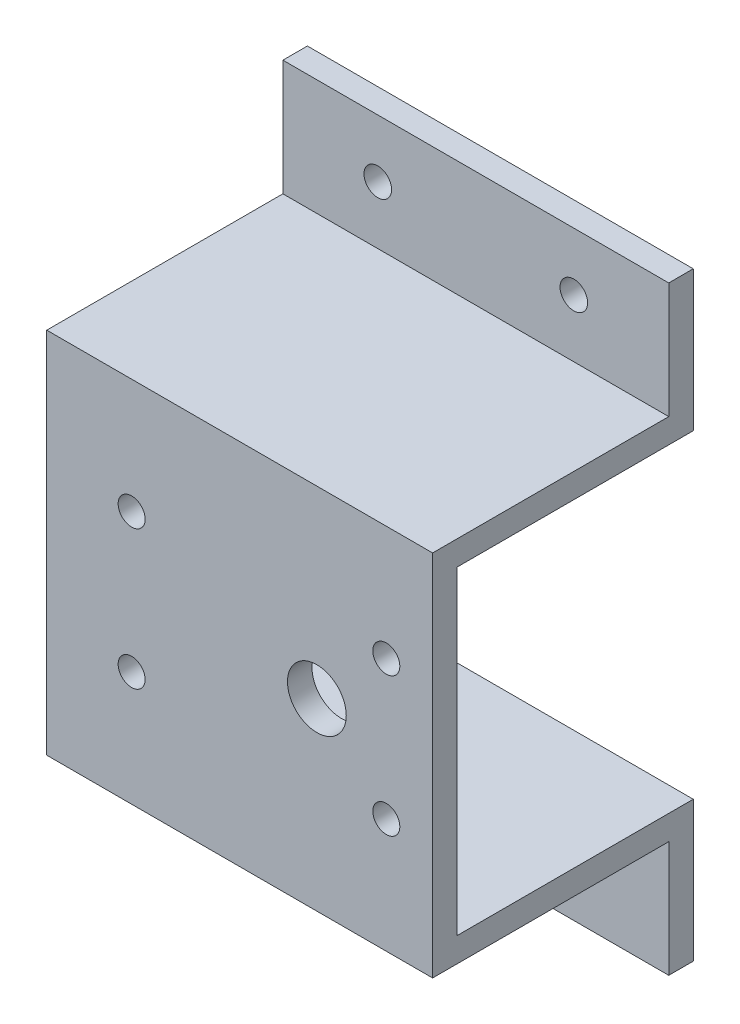
ISO-10303-21;
HEADER;
FILE_DESCRIPTION(('STEP AP214'),'2;1');
FILE_NAME('part.step','',(''),(''),'','','');
FILE_SCHEMA(('AUTOMOTIVE_DESIGN { 1 0 10303 214 1 1 1 1 }'));
ENDSEC;
DATA;
#1=APPLICATION_CONTEXT('core data for automotive mechanical design processes');
#2=APPLICATION_PROTOCOL_DEFINITION('international standard','automotive_design',2000,#1);
#3=PRODUCT_CONTEXT('',#1,'mechanical');
#4=PRODUCT('Part','Part','',(#3));
#5=PRODUCT_RELATED_PRODUCT_CATEGORY('part','',(#4));
#6=PRODUCT_DEFINITION_FORMATION('','',#4);
#7=PRODUCT_DEFINITION_CONTEXT('part definition',#1,'design');
#8=PRODUCT_DEFINITION('design','',#6,#7);
#9=PRODUCT_DEFINITION_SHAPE('','',#8);
#10=(LENGTH_UNIT() NAMED_UNIT(*) SI_UNIT(.MILLI.,.METRE.));
#11=(NAMED_UNIT(*) PLANE_ANGLE_UNIT() SI_UNIT($,.RADIAN.));
#12=(NAMED_UNIT(*) SI_UNIT($,.STERADIAN.) SOLID_ANGLE_UNIT());
#13=UNCERTAINTY_MEASURE_WITH_UNIT(LENGTH_MEASURE(1.E-05),#10,'distance_accuracy_value','');
#14=(GEOMETRIC_REPRESENTATION_CONTEXT(3) GLOBAL_UNCERTAINTY_ASSIGNED_CONTEXT((#13)) GLOBAL_UNIT_ASSIGNED_CONTEXT((#10,
#11,#12)) REPRESENTATION_CONTEXT('',''));
#15=CARTESIAN_POINT('',(0.,0.,0.));
#16=DIRECTION('',(0.,0.,1.));
#17=DIRECTION('',(1.,0.,0.));
#18=AXIS2_PLACEMENT_3D('',#15,#16,#17);
#19=CARTESIAN_POINT('',(0.,-23.85,3.175));
#20=DIRECTION('',(0.,-1.,0.));
#21=DIRECTION('',(1.,0.,0.));
#22=AXIS2_PLACEMENT_3D('',#19,#20,#21);
#23=PLANE('',#22);
#24=DIRECTION('',(0.,0.,-1.));
#25=VECTOR('',#24,1.);
#26=CARTESIAN_POINT('',(-35.,-23.85,3.175));
#27=LINE('',#26,#25);
#28=CARTESIAN_POINT('',(-35.,-23.85,3.175));
#29=VERTEX_POINT('',#28);
#30=CARTESIAN_POINT('',(-35.,-23.85,-27.4226));
#31=VERTEX_POINT('',#30);
#32=EDGE_CURVE('E283',#29,#31,#27,.T.);
#33=ORIENTED_EDGE('',*,*,#32,.T.);
#34=DIRECTION('',(1.,0.,0.));
#35=VECTOR('',#34,1.);
#36=CARTESIAN_POINT('',(-35.,-23.85,-27.4226));
#37=LINE('',#36,#35);
#38=CARTESIAN_POINT('',(15.,-23.85,-27.4226));
#39=VERTEX_POINT('',#38);
#40=EDGE_CURVE('E151',#31,#39,#37,.T.);
#41=ORIENTED_EDGE('',*,*,#40,.T.);
#42=DIRECTION('',(0.,0.,-1.));
#43=VECTOR('',#42,1.);
#44=CARTESIAN_POINT('',(15.,-23.85,3.175));
#45=LINE('',#44,#43);
#46=CARTESIAN_POINT('',(15.,-23.85,3.175));
#47=VERTEX_POINT('',#46);
#48=EDGE_CURVE('E11',#47,#39,#45,.T.);
#49=ORIENTED_EDGE('',*,*,#48,.F.);
#50=DIRECTION('',(-1.,0.,0.));
#51=VECTOR('',#50,1.);
#52=CARTESIAN_POINT('',(0.,-23.85,3.175));
#53=LINE('',#52,#51);
#54=EDGE_CURVE('E248',#47,#29,#53,.T.);
#55=ORIENTED_EDGE('',*,*,#54,.T.);
#56=EDGE_LOOP('',(#33,#41,#49,#55));
#57=FACE_BOUND('',#56,.T.);
#58=ADVANCED_FACE('F38',(#57),#23,.T.);
#59=CARTESIAN_POINT('',(0.,23.85,3.175));
#60=DIRECTION('',(0.,-1.,0.));
#61=DIRECTION('',(1.,0.,0.));
#62=AXIS2_PLACEMENT_3D('',#59,#60,#61);
#63=PLANE('',#62);
#64=DIRECTION('',(1.,0.,0.));
#65=VECTOR('',#64,1.);
#66=CARTESIAN_POINT('',(-35.,23.85,-27.4226));
#67=LINE('',#66,#65);
#68=CARTESIAN_POINT('',(-35.,23.85,-27.4226));
#69=VERTEX_POINT('',#68);
#70=CARTESIAN_POINT('',(15.,23.85,-27.4226));
#71=VERTEX_POINT('',#70);
#72=EDGE_CURVE('E61',#69,#71,#67,.T.);
#73=ORIENTED_EDGE('',*,*,#72,.F.);
#74=DIRECTION('',(0.,0.,-1.));
#75=VECTOR('',#74,1.);
#76=CARTESIAN_POINT('',(-35.,23.85,3.175));
#77=LINE('',#76,#75);
#78=CARTESIAN_POINT('',(-35.,23.85,3.175));
#79=VERTEX_POINT('',#78);
#80=EDGE_CURVE('E311',#79,#69,#77,.T.);
#81=ORIENTED_EDGE('',*,*,#80,.F.);
#82=DIRECTION('',(-1.,0.,0.));
#83=VECTOR('',#82,1.);
#84=CARTESIAN_POINT('',(0.,23.85,3.175));
#85=LINE('',#84,#83);
#86=CARTESIAN_POINT('',(15.,23.85,3.175));
#87=VERTEX_POINT('',#86);
#88=EDGE_CURVE('E257',#87,#79,#85,.T.);
#89=ORIENTED_EDGE('',*,*,#88,.F.);
#90=DIRECTION('',(0.,0.,-1.));
#91=VECTOR('',#90,1.);
#92=CARTESIAN_POINT('',(15.,23.85,3.175));
#93=LINE('',#92,#91);
#94=EDGE_CURVE('E46',#87,#71,#93,.T.);
#95=ORIENTED_EDGE('',*,*,#94,.T.);
#96=EDGE_LOOP('',(#73,#81,#89,#95));
#97=FACE_BOUND('',#96,.T.);
#98=ADVANCED_FACE('F315',(#97),#63,.F.);
#99=CARTESIAN_POINT('',(0.,0.,0.));
#100=DIRECTION('',(0.,0.,1.));
#101=DIRECTION('',(1.,0.,0.));
#102=AXIS2_PLACEMENT_3D('',#99,#100,#101);
#103=PLANE('',#102);
#104=CARTESIAN_POINT('',(-24.,-9.,0.));
#105=DIRECTION('',(0.,0.,1.));
#106=DIRECTION('',(1.,0.,0.));
#107=AXIS2_PLACEMENT_3D('',#104,#105,#106);
#108=CIRCLE('',#107,1.75);
#109=CARTESIAN_POINT('',(-22.25,-9.,0.));
#110=VERTEX_POINT('',#109);
#111=EDGE_CURVE('E289',#110,#110,#108,.T.);
#112=ORIENTED_EDGE('',*,*,#111,.T.);
#113=EDGE_LOOP('',(#112));
#114=FACE_BOUND('',#113,.T.);
#115=CARTESIAN_POINT('',(9.,9.,0.));
#116=DIRECTION('',(0.,0.,1.));
#117=DIRECTION('',(1.,0.,0.));
#118=AXIS2_PLACEMENT_3D('',#115,#116,#117);
#119=CIRCLE('',#118,1.75);
#120=CARTESIAN_POINT('',(10.75,9.,0.));
#121=VERTEX_POINT('',#120);
#122=EDGE_CURVE('E293',#121,#121,#119,.T.);
#123=ORIENTED_EDGE('',*,*,#122,.T.);
#124=EDGE_LOOP('',(#123));
#125=FACE_BOUND('',#124,.T.);
#126=CARTESIAN_POINT('',(0.,0.,0.));
#127=DIRECTION('',(0.,0.,1.));
#128=DIRECTION('',(1.,0.,0.));
#129=AXIS2_PLACEMENT_3D('',#126,#127,#128);
#130=CIRCLE('',#129,3.81);
#131=CARTESIAN_POINT('',(3.81,0.,0.));
#132=VERTEX_POINT('',#131);
#133=EDGE_CURVE('E297',#132,#132,#130,.T.);
#134=ORIENTED_EDGE('',*,*,#133,.T.);
#135=EDGE_LOOP('',(#134));
#136=FACE_BOUND('',#135,.T.);
#137=CARTESIAN_POINT('',(9.,-9.,0.));
#138=DIRECTION('',(0.,0.,1.));
#139=DIRECTION('',(1.,0.,0.));
#140=AXIS2_PLACEMENT_3D('',#137,#138,#139);
#141=CIRCLE('',#140,1.75);
#142=CARTESIAN_POINT('',(10.75,-9.,0.));
#143=VERTEX_POINT('',#142);
#144=EDGE_CURVE('E301',#143,#143,#141,.T.);
#145=ORIENTED_EDGE('',*,*,#144,.T.);
#146=EDGE_LOOP('',(#145));
#147=FACE_BOUND('',#146,.T.);
#148=CARTESIAN_POINT('',(-24.,9.,0.));
#149=DIRECTION('',(0.,0.,1.));
#150=DIRECTION('',(1.,0.,0.));
#151=AXIS2_PLACEMENT_3D('',#148,#149,#150);
#152=CIRCLE('',#151,1.75);
#153=CARTESIAN_POINT('',(-22.25,9.,0.));
#154=VERTEX_POINT('',#153);
#155=EDGE_CURVE('E253',#154,#154,#152,.T.);
#156=ORIENTED_EDGE('',*,*,#155,.T.);
#157=EDGE_LOOP('',(#156));
#158=FACE_BOUND('',#157,.T.);
#159=DIRECTION('',(-1.,0.,0.));
#160=VECTOR('',#159,1.);
#161=CARTESIAN_POINT('',(15.,20.675,0.));
#162=LINE('',#161,#160);
#163=CARTESIAN_POINT('',(15.,20.675,0.));
#164=VERTEX_POINT('',#163);
#165=CARTESIAN_POINT('',(-35.,20.675,0.));
#166=VERTEX_POINT('',#165);
#167=EDGE_CURVE('E214',#164,#166,#162,.T.);
#168=ORIENTED_EDGE('',*,*,#167,.F.);
#169=DIRECTION('',(0.,-1.,0.));
#170=VECTOR('',#169,1.);
#171=CARTESIAN_POINT('',(15.,0.,0.));
#172=LINE('',#171,#170);
#173=CARTESIAN_POINT('',(15.,-20.675,0.));
#174=VERTEX_POINT('',#173);
#175=EDGE_CURVE('E247',#164,#174,#172,.T.);
#176=ORIENTED_EDGE('',*,*,#175,.T.);
#177=DIRECTION('',(1.,0.,0.));
#178=VECTOR('',#177,1.);
#179=CARTESIAN_POINT('',(-35.,-20.675,0.));
#180=LINE('',#179,#178);
#181=CARTESIAN_POINT('',(-35.,-20.675,0.));
#182=VERTEX_POINT('',#181);
#183=EDGE_CURVE('E141',#182,#174,#180,.T.);
#184=ORIENTED_EDGE('',*,*,#183,.F.);
#185=DIRECTION('',(0.,-1.,0.));
#186=VECTOR('',#185,1.);
#187=CARTESIAN_POINT('',(-35.,0.,0.));
#188=LINE('',#187,#186);
#189=EDGE_CURVE('E286',#166,#182,#188,.T.);
#190=ORIENTED_EDGE('',*,*,#189,.F.);
#191=EDGE_LOOP('',(#168,#176,#184,#190));
#192=FACE_BOUND('',#191,.T.);
#193=ADVANCED_FACE('F361',(#114,#125,#136,#147,#158,#192),#103,.F.);
#194=CARTESIAN_POINT('',(15.,0.,3.175));
#195=DIRECTION('',(1.,0.,0.));
#196=DIRECTION('',(0.,0.,-1.));
#197=AXIS2_PLACEMENT_3D('',#194,#195,#196);
#198=PLANE('',#197);
#199=ORIENTED_EDGE('',*,*,#175,.F.);
#200=DIRECTION('',(0.,0.,1.));
#201=VECTOR('',#200,1.);
#202=CARTESIAN_POINT('',(15.,20.675,-30.5976));
#203=LINE('',#202,#201);
#204=CARTESIAN_POINT('',(15.,20.675,-30.5976));
#205=VERTEX_POINT('',#204);
#206=EDGE_CURVE('E231',#205,#164,#203,.T.);
#207=ORIENTED_EDGE('',*,*,#206,.F.);
#208=DIRECTION('',(0.,-1.,0.));
#209=VECTOR('',#208,1.);
#210=CARTESIAN_POINT('',(15.,23.85,-30.5976));
#211=LINE('',#210,#209);
#212=CARTESIAN_POINT('',(15.,38.85,-30.5976));
#213=VERTEX_POINT('',#212);
#214=EDGE_CURVE('E215',#213,#205,#211,.T.);
#215=ORIENTED_EDGE('',*,*,#214,.F.);
#216=DIRECTION('',(0.,0.,-1.));
#217=VECTOR('',#216,1.);
#218=CARTESIAN_POINT('',(15.,38.85,-30.5976));
#219=LINE('',#218,#217);
#220=CARTESIAN_POINT('',(15.,38.85,-27.4226));
#221=VERTEX_POINT('',#220);
#222=EDGE_CURVE('E196',#221,#213,#219,.T.);
#223=ORIENTED_EDGE('',*,*,#222,.F.);
#224=DIRECTION('',(0.,-1.,0.));
#225=VECTOR('',#224,1.);
#226=CARTESIAN_POINT('',(15.,38.85,-27.4226));
#227=LINE('',#226,#225);
#228=EDGE_CURVE('E204',#221,#71,#227,.T.);
#229=ORIENTED_EDGE('',*,*,#228,.T.);
#230=ORIENTED_EDGE('',*,*,#94,.F.);
#231=DIRECTION('',(0.,-1.,0.));
#232=VECTOR('',#231,1.);
#233=CARTESIAN_POINT('',(15.,0.,3.175));
#234=LINE('',#233,#232);
#235=EDGE_CURVE('E252',#87,#47,#234,.T.);
#236=ORIENTED_EDGE('',*,*,#235,.T.);
#237=ORIENTED_EDGE('',*,*,#48,.T.);
#238=DIRECTION('',(0.,1.,0.));
#239=VECTOR('',#238,1.);
#240=CARTESIAN_POINT('',(15.,-38.85,-27.4226));
#241=LINE('',#240,#239);
#242=CARTESIAN_POINT('',(15.,-38.85,-27.4226));
#243=VERTEX_POINT('',#242);
#244=EDGE_CURVE('E53',#243,#39,#241,.T.);
#245=ORIENTED_EDGE('',*,*,#244,.F.);
#246=DIRECTION('',(0.,0.,-1.));
#247=VECTOR('',#246,1.);
#248=CARTESIAN_POINT('',(15.,-38.85,-30.5976));
#249=LINE('',#248,#247);
#250=CARTESIAN_POINT('',(15.,-38.85,-30.5976));
#251=VERTEX_POINT('',#250);
#252=EDGE_CURVE('E157',#243,#251,#249,.T.);
#253=ORIENTED_EDGE('',*,*,#252,.T.);
#254=DIRECTION('',(0.,-1.,0.));
#255=VECTOR('',#254,1.);
#256=CARTESIAN_POINT('',(15.,-23.85,-30.5976));
#257=LINE('',#256,#255);
#258=CARTESIAN_POINT('',(15.,-20.675,-30.5976));
#259=VERTEX_POINT('',#258);
#260=EDGE_CURVE('E155',#259,#251,#257,.T.);
#261=ORIENTED_EDGE('',*,*,#260,.F.);
#262=DIRECTION('',(0.,0.,1.));
#263=VECTOR('',#262,1.);
#264=CARTESIAN_POINT('',(15.,-20.675,-30.5976));
#265=LINE('',#264,#263);
#266=EDGE_CURVE('E238',#259,#174,#265,.T.);
#267=ORIENTED_EDGE('',*,*,#266,.T.);
#268=EDGE_LOOP('',(#199,#207,#215,#223,#229,#230,#236,#237,#245,#253,#261,#267));
#269=FACE_BOUND('',#268,.T.);
#270=ADVANCED_FACE('F324',(#269),#198,.T.);
#271=CARTESIAN_POINT('',(9.,-9.,3.175));
#272=DIRECTION('',(0.,0.,-1.));
#273=DIRECTION('',(-1.,0.,0.));
#274=AXIS2_PLACEMENT_3D('',#271,#272,#273);
#275=CYLINDRICAL_SURFACE('',#274,1.75);
#276=CARTESIAN_POINT('',(9.,-9.,3.175));
#277=DIRECTION('',(0.,0.,1.));
#278=DIRECTION('',(1.,0.,0.));
#279=AXIS2_PLACEMENT_3D('',#276,#277,#278);
#280=CIRCLE('',#279,1.75);
#281=CARTESIAN_POINT('',(10.75,-9.,3.175));
#282=VERTEX_POINT('',#281);
#283=EDGE_CURVE('E275',#282,#282,#280,.T.);
#284=ORIENTED_EDGE('',*,*,#283,.T.);
#285=EDGE_LOOP('',(#284));
#286=FACE_BOUND('',#285,.T.);
#287=ORIENTED_EDGE('',*,*,#144,.F.);
#288=EDGE_LOOP('',(#287));
#289=FACE_BOUND('',#288,.T.);
#290=ADVANCED_FACE('F371',(#286,#289),#275,.F.);
#291=CARTESIAN_POINT('',(0.,0.,3.175));
#292=DIRECTION('',(0.,0.,-1.));
#293=DIRECTION('',(-1.,0.,0.));
#294=AXIS2_PLACEMENT_3D('',#291,#292,#293);
#295=CYLINDRICAL_SURFACE('',#294,3.81);
#296=CARTESIAN_POINT('',(0.,0.,3.175));
#297=DIRECTION('',(0.,0.,1.));
#298=DIRECTION('',(1.,0.,0.));
#299=AXIS2_PLACEMENT_3D('',#296,#297,#298);
#300=CIRCLE('',#299,3.81);
#301=CARTESIAN_POINT('',(3.81,0.,3.175));
#302=VERTEX_POINT('',#301);
#303=EDGE_CURVE('E271',#302,#302,#300,.T.);
#304=ORIENTED_EDGE('',*,*,#303,.T.);
#305=EDGE_LOOP('',(#304));
#306=FACE_BOUND('',#305,.T.);
#307=ORIENTED_EDGE('',*,*,#133,.F.);
#308=EDGE_LOOP('',(#307));
#309=FACE_BOUND('',#308,.T.);
#310=ADVANCED_FACE('F375',(#306,#309),#295,.F.);
#311=CARTESIAN_POINT('',(9.,9.,3.175));
#312=DIRECTION('',(0.,0.,-1.));
#313=DIRECTION('',(-1.,0.,0.));
#314=AXIS2_PLACEMENT_3D('',#311,#312,#313);
#315=CYLINDRICAL_SURFACE('',#314,1.75);
#316=CARTESIAN_POINT('',(9.,9.,3.175));
#317=DIRECTION('',(0.,0.,1.));
#318=DIRECTION('',(1.,0.,0.));
#319=AXIS2_PLACEMENT_3D('',#316,#317,#318);
#320=CIRCLE('',#319,1.75);
#321=CARTESIAN_POINT('',(10.75,9.,3.175));
#322=VERTEX_POINT('',#321);
#323=EDGE_CURVE('E267',#322,#322,#320,.T.);
#324=ORIENTED_EDGE('',*,*,#323,.T.);
#325=EDGE_LOOP('',(#324));
#326=FACE_BOUND('',#325,.T.);
#327=ORIENTED_EDGE('',*,*,#122,.F.);
#328=EDGE_LOOP('',(#327));
#329=FACE_BOUND('',#328,.T.);
#330=ADVANCED_FACE('F381',(#326,#329),#315,.F.);
#331=CARTESIAN_POINT('',(-24.,-9.,3.175));
#332=DIRECTION('',(0.,0.,-1.));
#333=DIRECTION('',(-1.,0.,0.));
#334=AXIS2_PLACEMENT_3D('',#331,#332,#333);
#335=CYLINDRICAL_SURFACE('',#334,1.75);
#336=CARTESIAN_POINT('',(-24.,-9.,3.175));
#337=DIRECTION('',(0.,0.,1.));
#338=DIRECTION('',(1.,0.,0.));
#339=AXIS2_PLACEMENT_3D('',#336,#337,#338);
#340=CIRCLE('',#339,1.75);
#341=CARTESIAN_POINT('',(-22.25,-9.,3.175));
#342=VERTEX_POINT('',#341);
#343=EDGE_CURVE('E263',#342,#342,#340,.T.);
#344=ORIENTED_EDGE('',*,*,#343,.T.);
#345=EDGE_LOOP('',(#344));
#346=FACE_BOUND('',#345,.T.);
#347=ORIENTED_EDGE('',*,*,#111,.F.);
#348=EDGE_LOOP('',(#347));
#349=FACE_BOUND('',#348,.T.);
#350=ADVANCED_FACE('F389',(#346,#349),#335,.F.);
#351=CARTESIAN_POINT('',(-35.,0.,3.175));
#352=DIRECTION('',(1.,0.,0.));
#353=DIRECTION('',(0.,0.,-1.));
#354=AXIS2_PLACEMENT_3D('',#351,#352,#353);
#355=PLANE('',#354);
#356=ORIENTED_EDGE('',*,*,#80,.T.);
#357=DIRECTION('',(0.,-1.,0.));
#358=VECTOR('',#357,1.);
#359=CARTESIAN_POINT('',(-35.,38.85,-27.4226));
#360=LINE('',#359,#358);
#361=CARTESIAN_POINT('',(-35.,38.85,-27.4226));
#362=VERTEX_POINT('',#361);
#363=EDGE_CURVE('E210',#362,#69,#360,.T.);
#364=ORIENTED_EDGE('',*,*,#363,.F.);
#365=DIRECTION('',(0.,0.,1.));
#366=VECTOR('',#365,1.);
#367=CARTESIAN_POINT('',(-35.,38.85,-30.5976));
#368=LINE('',#367,#366);
#369=CARTESIAN_POINT('',(-35.,38.85,-30.5976));
#370=VERTEX_POINT('',#369);
#371=EDGE_CURVE('E189',#370,#362,#368,.T.);
#372=ORIENTED_EDGE('',*,*,#371,.F.);
#373=DIRECTION('',(0.,1.,0.));
#374=VECTOR('',#373,1.);
#375=CARTESIAN_POINT('',(-35.,23.85,-30.5976));
#376=LINE('',#375,#374);
#377=CARTESIAN_POINT('',(-35.,20.675,-30.5976));
#378=VERTEX_POINT('',#377);
#379=EDGE_CURVE('E222',#378,#370,#376,.T.);
#380=ORIENTED_EDGE('',*,*,#379,.F.);
#381=DIRECTION('',(0.,0.,1.));
#382=VECTOR('',#381,1.);
#383=CARTESIAN_POINT('',(-35.,20.675,-30.5976));
#384=LINE('',#383,#382);
#385=EDGE_CURVE('E225',#378,#166,#384,.T.);
#386=ORIENTED_EDGE('',*,*,#385,.T.);
#387=ORIENTED_EDGE('',*,*,#189,.T.);
#388=DIRECTION('',(0.,0.,1.));
#389=VECTOR('',#388,1.);
#390=CARTESIAN_POINT('',(-35.,-20.675,-30.5976));
#391=LINE('',#390,#389);
#392=CARTESIAN_POINT('',(-35.,-20.675,-30.5976));
#393=VERTEX_POINT('',#392);
#394=EDGE_CURVE('E136',#393,#182,#391,.T.);
#395=ORIENTED_EDGE('',*,*,#394,.F.);
#396=DIRECTION('',(0.,1.,0.));
#397=VECTOR('',#396,1.);
#398=CARTESIAN_POINT('',(-35.,-23.85,-30.5976));
#399=LINE('',#398,#397);
#400=CARTESIAN_POINT('',(-35.,-38.85,-30.5976));
#401=VERTEX_POINT('',#400);
#402=EDGE_CURVE('E130',#401,#393,#399,.T.);
#403=ORIENTED_EDGE('',*,*,#402,.F.);
#404=DIRECTION('',(0.,0.,1.));
#405=VECTOR('',#404,1.);
#406=CARTESIAN_POINT('',(-35.,-38.85,-30.5976));
#407=LINE('',#406,#405);
#408=CARTESIAN_POINT('',(-35.,-38.85,-27.4226));
#409=VERTEX_POINT('',#408);
#410=EDGE_CURVE('E133',#401,#409,#407,.T.);
#411=ORIENTED_EDGE('',*,*,#410,.T.);
#412=DIRECTION('',(0.,1.,0.));
#413=VECTOR('',#412,1.);
#414=CARTESIAN_POINT('',(-35.,-38.85,-27.4226));
#415=LINE('',#414,#413);
#416=EDGE_CURVE('E165',#409,#31,#415,.T.);
#417=ORIENTED_EDGE('',*,*,#416,.T.);
#418=ORIENTED_EDGE('',*,*,#32,.F.);
#419=DIRECTION('',(0.,-1.,0.));
#420=VECTOR('',#419,1.);
#421=CARTESIAN_POINT('',(-35.,0.,3.175));
#422=LINE('',#421,#420);
#423=EDGE_CURVE('E260',#79,#29,#422,.T.);
#424=ORIENTED_EDGE('',*,*,#423,.F.);
#425=EDGE_LOOP('',(#356,#364,#372,#380,#386,#387,#395,#403,#411,#417,#418,#424));
#426=FACE_BOUND('',#425,.T.);
#427=ADVANCED_FACE('F132',(#426),#355,.F.);
#428=CARTESIAN_POINT('',(-24.,9.,3.175));
#429=DIRECTION('',(0.,0.,-1.));
#430=DIRECTION('',(-1.,0.,0.));
#431=AXIS2_PLACEMENT_3D('',#428,#429,#430);
#432=CYLINDRICAL_SURFACE('',#431,1.75);
#433=CARTESIAN_POINT('',(-24.,9.,3.175));
#434=DIRECTION('',(0.,0.,1.));
#435=DIRECTION('',(1.,0.,0.));
#436=AXIS2_PLACEMENT_3D('',#433,#434,#435);
#437=CIRCLE('',#436,1.75);
#438=CARTESIAN_POINT('',(-22.25,9.,3.175));
#439=VERTEX_POINT('',#438);
#440=EDGE_CURVE('E279',#439,#439,#437,.T.);
#441=ORIENTED_EDGE('',*,*,#440,.T.);
#442=EDGE_LOOP('',(#441));
#443=FACE_BOUND('',#442,.T.);
#444=ORIENTED_EDGE('',*,*,#155,.F.);
#445=EDGE_LOOP('',(#444));
#446=FACE_BOUND('',#445,.T.);
#447=ADVANCED_FACE('F386',(#443,#446),#432,.F.);
#448=CARTESIAN_POINT('',(0.,0.,3.175));
#449=DIRECTION('',(0.,0.,1.));
#450=DIRECTION('',(1.,0.,0.));
#451=AXIS2_PLACEMENT_3D('',#448,#449,#450);
#452=PLANE('',#451);
#453=ORIENTED_EDGE('',*,*,#54,.F.);
#454=ORIENTED_EDGE('',*,*,#235,.F.);
#455=ORIENTED_EDGE('',*,*,#88,.T.);
#456=ORIENTED_EDGE('',*,*,#423,.T.);
#457=EDGE_LOOP('',(#453,#454,#455,#456));
#458=FACE_BOUND('',#457,.T.);
#459=ORIENTED_EDGE('',*,*,#343,.F.);
#460=EDGE_LOOP('',(#459));
#461=FACE_BOUND('',#460,.T.);
#462=ORIENTED_EDGE('',*,*,#323,.F.);
#463=EDGE_LOOP('',(#462));
#464=FACE_BOUND('',#463,.T.);
#465=ORIENTED_EDGE('',*,*,#303,.F.);
#466=EDGE_LOOP('',(#465));
#467=FACE_BOUND('',#466,.T.);
#468=ORIENTED_EDGE('',*,*,#283,.F.);
#469=EDGE_LOOP('',(#468));
#470=FACE_BOUND('',#469,.T.);
#471=ORIENTED_EDGE('',*,*,#440,.F.);
#472=EDGE_LOOP('',(#471));
#473=FACE_BOUND('',#472,.T.);
#474=ADVANCED_FACE('F338',(#458,#461,#464,#467,#470,#473),#452,.T.);
#475=CARTESIAN_POINT('',(-35.,-20.675,-30.5976));
#476=DIRECTION('',(0.,-1.,0.));
#477=DIRECTION('',(1.,0.,0.));
#478=AXIS2_PLACEMENT_3D('',#475,#476,#477);
#479=PLANE('',#478);
#480=ORIENTED_EDGE('',*,*,#183,.T.);
#481=ORIENTED_EDGE('',*,*,#266,.F.);
#482=DIRECTION('',(1.,0.,0.));
#483=VECTOR('',#482,1.);
#484=CARTESIAN_POINT('',(-35.,-20.675,-30.5976));
#485=LINE('',#484,#483);
#486=EDGE_CURVE('E140',#393,#259,#485,.T.);
#487=ORIENTED_EDGE('',*,*,#486,.F.);
#488=ORIENTED_EDGE('',*,*,#394,.T.);
#489=EDGE_LOOP('',(#480,#481,#487,#488));
#490=FACE_BOUND('',#489,.T.);
#491=ADVANCED_FACE('F414',(#490),#479,.F.);
#492=CARTESIAN_POINT('',(0.,0.,-30.5976));
#493=DIRECTION('',(0.,0.,-1.));
#494=DIRECTION('',(-1.,0.,0.));
#495=AXIS2_PLACEMENT_3D('',#492,#493,#494);
#496=PLANE('',#495);
#497=CARTESIAN_POINT('',(2.7,-31.35,-30.5976));
#498=DIRECTION('',(0.,0.,-1.));
#499=DIRECTION('',(-1.,0.,0.));
#500=AXIS2_PLACEMENT_3D('',#497,#498,#499);
#501=CIRCLE('',#500,1.7859375);
#502=CARTESIAN_POINT('',(0.9140625,-31.35,-30.5976));
#503=VERTEX_POINT('',#502);
#504=EDGE_CURVE('E168',#503,#503,#501,.T.);
#505=ORIENTED_EDGE('',*,*,#504,.F.);
#506=EDGE_LOOP('',(#505));
#507=FACE_BOUND('',#506,.T.);
#508=CARTESIAN_POINT('',(-22.7,-31.35,-30.5976));
#509=DIRECTION('',(0.,0.,-1.));
#510=DIRECTION('',(-1.,0.,0.));
#511=AXIS2_PLACEMENT_3D('',#508,#509,#510);
#512=CIRCLE('',#511,1.7859375);
#513=CARTESIAN_POINT('',(-24.4859375,-31.35,-30.5976));
#514=VERTEX_POINT('',#513);
#515=EDGE_CURVE('E516',#514,#514,#512,.T.);
#516=ORIENTED_EDGE('',*,*,#515,.F.);
#517=EDGE_LOOP('',(#516));
#518=FACE_BOUND('',#517,.T.);
#519=ORIENTED_EDGE('',*,*,#402,.T.);
#520=ORIENTED_EDGE('',*,*,#486,.T.);
#521=ORIENTED_EDGE('',*,*,#260,.T.);
#522=DIRECTION('',(-1.,0.,0.));
#523=VECTOR('',#522,1.);
#524=CARTESIAN_POINT('',(-35.,-38.85,-30.5976));
#525=LINE('',#524,#523);
#526=EDGE_CURVE('E147',#251,#401,#525,.T.);
#527=ORIENTED_EDGE('',*,*,#526,.T.);
#528=EDGE_LOOP('',(#519,#520,#521,#527));
#529=FACE_BOUND('',#528,.T.);
#530=ADVANCED_FACE('F153',(#507,#518,#529),#496,.T.);
#531=CARTESIAN_POINT('',(15.,20.675,-30.5976));
#532=DIRECTION('',(0.,1.,0.));
#533=DIRECTION('',(0.,0.,1.));
#534=AXIS2_PLACEMENT_3D('',#531,#532,#533);
#535=PLANE('',#534);
#536=ORIENTED_EDGE('',*,*,#167,.T.);
#537=ORIENTED_EDGE('',*,*,#385,.F.);
#538=DIRECTION('',(-1.,0.,0.));
#539=VECTOR('',#538,1.);
#540=CARTESIAN_POINT('',(15.,20.675,-30.5976));
#541=LINE('',#540,#539);
#542=EDGE_CURVE('E219',#205,#378,#541,.T.);
#543=ORIENTED_EDGE('',*,*,#542,.F.);
#544=ORIENTED_EDGE('',*,*,#206,.T.);
#545=EDGE_LOOP('',(#536,#537,#543,#544));
#546=FACE_BOUND('',#545,.T.);
#547=ADVANCED_FACE('F421',(#546),#535,.F.);
#548=CARTESIAN_POINT('',(0.,0.,-30.5976));
#549=DIRECTION('',(0.,0.,-1.));
#550=DIRECTION('',(-1.,0.,0.));
#551=AXIS2_PLACEMENT_3D('',#548,#549,#550);
#552=PLANE('',#551);
#553=CARTESIAN_POINT('',(2.7,31.35,-30.5976));
#554=DIRECTION('',(0.,0.,-1.));
#555=DIRECTION('',(-1.,0.,0.));
#556=AXIS2_PLACEMENT_3D('',#553,#554,#555);
#557=CIRCLE('',#556,1.7859375);
#558=CARTESIAN_POINT('',(0.9140625,31.35,-30.5976));
#559=VERTEX_POINT('',#558);
#560=EDGE_CURVE('E178',#559,#559,#557,.F.);
#561=ORIENTED_EDGE('',*,*,#560,.T.);
#562=EDGE_LOOP('',(#561));
#563=FACE_BOUND('',#562,.T.);
#564=CARTESIAN_POINT('',(-22.7,31.35,-30.5976));
#565=DIRECTION('',(0.,0.,-1.));
#566=DIRECTION('',(-1.,0.,0.));
#567=AXIS2_PLACEMENT_3D('',#564,#565,#566);
#568=CIRCLE('',#567,1.7859375);
#569=CARTESIAN_POINT('',(-24.4859375,31.35,-30.5976));
#570=VERTEX_POINT('',#569);
#571=EDGE_CURVE('E173',#570,#570,#568,.F.);
#572=ORIENTED_EDGE('',*,*,#571,.T.);
#573=EDGE_LOOP('',(#572));
#574=FACE_BOUND('',#573,.T.);
#575=ORIENTED_EDGE('',*,*,#214,.T.);
#576=ORIENTED_EDGE('',*,*,#542,.T.);
#577=ORIENTED_EDGE('',*,*,#379,.T.);
#578=DIRECTION('',(-1.,0.,0.));
#579=VECTOR('',#578,1.);
#580=CARTESIAN_POINT('',(-35.,38.85,-30.5976));
#581=LINE('',#580,#579);
#582=EDGE_CURVE('E200',#213,#370,#581,.T.);
#583=ORIENTED_EDGE('',*,*,#582,.F.);
#584=EDGE_LOOP('',(#575,#576,#577,#583));
#585=FACE_BOUND('',#584,.T.);
#586=ADVANCED_FACE('F331',(#563,#574,#585),#552,.T.);
#587=CARTESIAN_POINT('',(-35.,38.85,-27.4226));
#588=DIRECTION('',(0.,0.,-1.));
#589=DIRECTION('',(-1.,0.,0.));
#590=AXIS2_PLACEMENT_3D('',#587,#588,#589);
#591=PLANE('',#590);
#592=CARTESIAN_POINT('',(2.7,31.35,-27.4226));
#593=DIRECTION('',(0.,0.,1.));
#594=DIRECTION('',(1.,0.,0.));
#595=AXIS2_PLACEMENT_3D('',#592,#593,#594);
#596=CIRCLE('',#595,1.7859375);
#597=CARTESIAN_POINT('',(4.4859375,31.35,-27.4226));
#598=VERTEX_POINT('',#597);
#599=EDGE_CURVE('E174',#598,#598,#596,.T.);
#600=ORIENTED_EDGE('',*,*,#599,.F.);
#601=EDGE_LOOP('',(#600));
#602=FACE_BOUND('',#601,.T.);
#603=CARTESIAN_POINT('',(-22.7,31.35,-27.4226));
#604=DIRECTION('',(0.,0.,1.));
#605=DIRECTION('',(1.,0.,0.));
#606=AXIS2_PLACEMENT_3D('',#603,#604,#605);
#607=CIRCLE('',#606,1.7859375);
#608=CARTESIAN_POINT('',(-20.9140625,31.35,-27.4226));
#609=VERTEX_POINT('',#608);
#610=EDGE_CURVE('E182',#609,#609,#607,.T.);
#611=ORIENTED_EDGE('',*,*,#610,.F.);
#612=EDGE_LOOP('',(#611));
#613=FACE_BOUND('',#612,.T.);
#614=ORIENTED_EDGE('',*,*,#72,.T.);
#615=ORIENTED_EDGE('',*,*,#228,.F.);
#616=DIRECTION('',(1.,0.,0.));
#617=VECTOR('',#616,1.);
#618=CARTESIAN_POINT('',(-35.,38.85,-27.4226));
#619=LINE('',#618,#617);
#620=EDGE_CURVE('E193',#362,#221,#619,.T.);
#621=ORIENTED_EDGE('',*,*,#620,.F.);
#622=ORIENTED_EDGE('',*,*,#363,.T.);
#623=EDGE_LOOP('',(#614,#615,#621,#622));
#624=FACE_BOUND('',#623,.T.);
#625=ADVANCED_FACE('F320',(#602,#613,#624),#591,.F.);
#626=CARTESIAN_POINT('',(0.,38.85,0.));
#627=DIRECTION('',(0.,1.,0.));
#628=DIRECTION('',(-1.,0.,0.));
#629=AXIS2_PLACEMENT_3D('',#626,#627,#628);
#630=PLANE('',#629);
#631=ORIENTED_EDGE('',*,*,#371,.T.);
#632=ORIENTED_EDGE('',*,*,#620,.T.);
#633=ORIENTED_EDGE('',*,*,#222,.T.);
#634=ORIENTED_EDGE('',*,*,#582,.T.);
#635=EDGE_LOOP('',(#631,#632,#633,#634));
#636=FACE_BOUND('',#635,.T.);
#637=ADVANCED_FACE('F328',(#636),#630,.T.);
#638=CARTESIAN_POINT('',(-22.7,31.35,-30.5986));
#639=DIRECTION('',(0.,0.,1.));
#640=DIRECTION('',(1.,0.,0.));
#641=AXIS2_PLACEMENT_3D('',#638,#639,#640);
#642=CYLINDRICAL_SURFACE('',#641,1.7859375);
#643=ORIENTED_EDGE('',*,*,#571,.F.);
#644=EDGE_LOOP('',(#643));
#645=FACE_BOUND('',#644,.T.);
#646=ORIENTED_EDGE('',*,*,#610,.T.);
#647=EDGE_LOOP('',(#646));
#648=FACE_BOUND('',#647,.T.);
#649=ADVANCED_FACE('F352',(#645,#648),#642,.F.);
#650=CARTESIAN_POINT('',(2.7,31.35,-30.5986));
#651=DIRECTION('',(0.,0.,1.));
#652=DIRECTION('',(1.,0.,0.));
#653=AXIS2_PLACEMENT_3D('',#650,#651,#652);
#654=CYLINDRICAL_SURFACE('',#653,1.7859375);
#655=ORIENTED_EDGE('',*,*,#560,.F.);
#656=EDGE_LOOP('',(#655));
#657=FACE_BOUND('',#656,.T.);
#658=ORIENTED_EDGE('',*,*,#599,.T.);
#659=EDGE_LOOP('',(#658));
#660=FACE_BOUND('',#659,.T.);
#661=ADVANCED_FACE('F343',(#657,#660),#654,.F.);
#662=CARTESIAN_POINT('',(-35.,-38.85,-27.4226));
#663=DIRECTION('',(0.,0.,1.));
#664=DIRECTION('',(1.,0.,0.));
#665=AXIS2_PLACEMENT_3D('',#662,#663,#664);
#666=PLANE('',#665);
#667=CARTESIAN_POINT('',(2.7,-31.35,-27.4226));
#668=DIRECTION('',(0.,0.,-1.));
#669=DIRECTION('',(1.,0.,0.));
#670=AXIS2_PLACEMENT_3D('',#667,#668,#669);
#671=CIRCLE('',#670,1.7859375);
#672=CARTESIAN_POINT('',(4.4859375,-31.35,-27.4226));
#673=VERTEX_POINT('',#672);
#674=EDGE_CURVE('E514',#673,#673,#671,.T.);
#675=ORIENTED_EDGE('',*,*,#674,.T.);
#676=EDGE_LOOP('',(#675));
#677=FACE_BOUND('',#676,.T.);
#678=CARTESIAN_POINT('',(-22.7,-31.35,-27.4226));
#679=DIRECTION('',(0.,0.,-1.));
#680=DIRECTION('',(1.,0.,0.));
#681=AXIS2_PLACEMENT_3D('',#678,#679,#680);
#682=CIRCLE('',#681,1.7859375);
#683=CARTESIAN_POINT('',(-20.9140625,-31.35,-27.4226));
#684=VERTEX_POINT('',#683);
#685=EDGE_CURVE('E522',#684,#684,#682,.T.);
#686=ORIENTED_EDGE('',*,*,#685,.T.);
#687=EDGE_LOOP('',(#686));
#688=FACE_BOUND('',#687,.T.);
#689=ORIENTED_EDGE('',*,*,#40,.F.);
#690=ORIENTED_EDGE('',*,*,#416,.F.);
#691=DIRECTION('',(1.,0.,0.));
#692=VECTOR('',#691,1.);
#693=CARTESIAN_POINT('',(-35.,-38.85,-27.4226));
#694=LINE('',#693,#692);
#695=EDGE_CURVE('E149',#409,#243,#694,.T.);
#696=ORIENTED_EDGE('',*,*,#695,.T.);
#697=ORIENTED_EDGE('',*,*,#244,.T.);
#698=EDGE_LOOP('',(#689,#690,#696,#697));
#699=FACE_BOUND('',#698,.T.);
#700=ADVANCED_FACE('F341',(#677,#688,#699),#666,.T.);
#701=CARTESIAN_POINT('',(0.,-38.85,0.));
#702=DIRECTION('',(0.,-1.,0.));
#703=DIRECTION('',(-1.,0.,0.));
#704=AXIS2_PLACEMENT_3D('',#701,#702,#703);
#705=PLANE('',#704);
#706=ORIENTED_EDGE('',*,*,#410,.F.);
#707=ORIENTED_EDGE('',*,*,#526,.F.);
#708=ORIENTED_EDGE('',*,*,#252,.F.);
#709=ORIENTED_EDGE('',*,*,#695,.F.);
#710=EDGE_LOOP('',(#706,#707,#708,#709));
#711=FACE_BOUND('',#710,.T.);
#712=ADVANCED_FACE('F145',(#711),#705,.T.);
#713=CARTESIAN_POINT('',(-22.7,-31.35,-30.5986));
#714=DIRECTION('',(0.,0.,1.));
#715=DIRECTION('',(1.,0.,0.));
#716=AXIS2_PLACEMENT_3D('',#713,#714,#715);
#717=CYLINDRICAL_SURFACE('',#716,1.7859375);
#718=ORIENTED_EDGE('',*,*,#515,.T.);
#719=EDGE_LOOP('',(#718));
#720=FACE_BOUND('',#719,.T.);
#721=ORIENTED_EDGE('',*,*,#685,.F.);
#722=EDGE_LOOP('',(#721));
#723=FACE_BOUND('',#722,.T.);
#724=ADVANCED_FACE('F350',(#720,#723),#717,.F.);
#725=CARTESIAN_POINT('',(2.7,-31.35,-30.5986));
#726=DIRECTION('',(0.,0.,1.));
#727=DIRECTION('',(1.,0.,0.));
#728=AXIS2_PLACEMENT_3D('',#725,#726,#727);
#729=CYLINDRICAL_SURFACE('',#728,1.7859375);
#730=ORIENTED_EDGE('',*,*,#504,.T.);
#731=EDGE_LOOP('',(#730));
#732=FACE_BOUND('',#731,.T.);
#733=ORIENTED_EDGE('',*,*,#674,.F.);
#734=EDGE_LOOP('',(#733));
#735=FACE_BOUND('',#734,.T.);
#736=ADVANCED_FACE('F496',(#732,#735),#729,.F.);
#737=CLOSED_SHELL('',(#58,#98,#193,#270,#290,#310,#330,#350,#427,#447,#474,#491,#530,#547,#586,
#625,#637,#649,#661,#700,#712,#724,#736));
#738=MANIFOLD_SOLID_BREP('B2',#737);
#739=ADVANCED_BREP_SHAPE_REPRESENTATION('',(#18,#738),#14);
#740=SHAPE_DEFINITION_REPRESENTATION(#9,#739);
ENDSEC;
END-ISO-10303-21;
